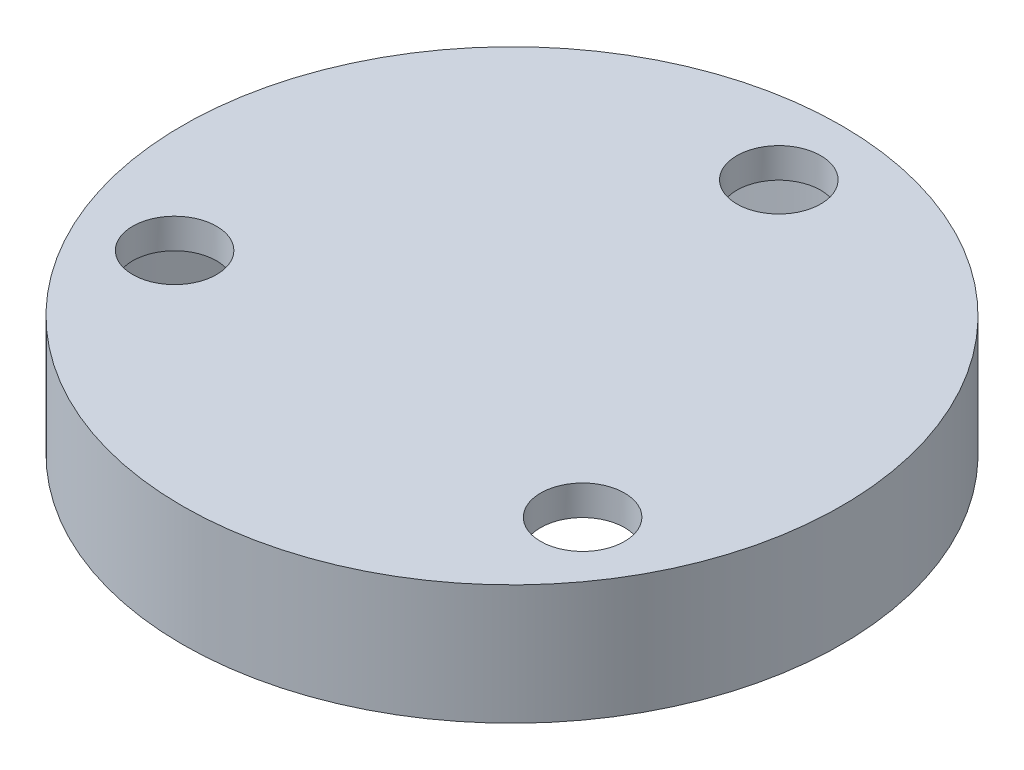
ISO-10303-21;
HEADER;
FILE_DESCRIPTION(('STEP AP214'),'2;1');
FILE_NAME('part.step','',(''),(''),'','','');
FILE_SCHEMA(('AUTOMOTIVE_DESIGN { 1 0 10303 214 1 1 1 1 }'));
ENDSEC;
DATA;
#1=APPLICATION_CONTEXT('core data for automotive mechanical design processes');
#2=APPLICATION_PROTOCOL_DEFINITION('international standard','automotive_design',2000,#1);
#3=PRODUCT_CONTEXT('',#1,'mechanical');
#4=PRODUCT('Part','Part','',(#3));
#5=PRODUCT_RELATED_PRODUCT_CATEGORY('part','',(#4));
#6=PRODUCT_DEFINITION_FORMATION('','',#4);
#7=PRODUCT_DEFINITION_CONTEXT('part definition',#1,'design');
#8=PRODUCT_DEFINITION('design','',#6,#7);
#9=PRODUCT_DEFINITION_SHAPE('','',#8);
#10=(LENGTH_UNIT() NAMED_UNIT(*) SI_UNIT(.MILLI.,.METRE.));
#11=(NAMED_UNIT(*) PLANE_ANGLE_UNIT() SI_UNIT($,.RADIAN.));
#12=(NAMED_UNIT(*) SI_UNIT($,.STERADIAN.) SOLID_ANGLE_UNIT());
#13=UNCERTAINTY_MEASURE_WITH_UNIT(LENGTH_MEASURE(1.E-05),#10,'distance_accuracy_value','');
#14=(GEOMETRIC_REPRESENTATION_CONTEXT(3) GLOBAL_UNCERTAINTY_ASSIGNED_CONTEXT((#13)) GLOBAL_UNIT_ASSIGNED_CONTEXT((#10,
#11,#12)) REPRESENTATION_CONTEXT('',''));
#15=CARTESIAN_POINT('',(0.,0.,0.));
#16=DIRECTION('',(0.,0.,1.));
#17=DIRECTION('',(1.,0.,0.));
#18=AXIS2_PLACEMENT_3D('',#15,#16,#17);
#19=CARTESIAN_POINT('',(0.,20.,0.));
#20=DIRECTION('',(0.,-1.,0.));
#21=DIRECTION('',(0.,0.,-1.));
#22=AXIS2_PLACEMENT_3D('',#19,#20,#21);
#23=CYLINDRICAL_SURFACE('',#22,55.);
#24=CARTESIAN_POINT('',(0.,20.,0.));
#25=DIRECTION('',(0.,1.,0.));
#26=DIRECTION('',(0.,0.,1.));
#27=AXIS2_PLACEMENT_3D('',#24,#25,#26);
#28=CIRCLE('',#27,55.);
#29=CARTESIAN_POINT('',(0.,20.,55.));
#30=VERTEX_POINT('',#29);
#31=EDGE_CURVE('E10',#30,#30,#28,.T.);
#32=ORIENTED_EDGE('',*,*,#31,.F.);
#33=EDGE_LOOP('',(#32));
#34=FACE_BOUND('',#33,.T.);
#35=CARTESIAN_POINT('',(0.,0.,0.));
#36=DIRECTION('',(0.,1.,0.));
#37=DIRECTION('',(0.,0.,1.));
#38=AXIS2_PLACEMENT_3D('',#35,#36,#37);
#39=CIRCLE('',#38,55.);
#40=CARTESIAN_POINT('',(0.,0.,55.));
#41=VERTEX_POINT('',#40);
#42=EDGE_CURVE('E46',#41,#41,#39,.T.);
#43=ORIENTED_EDGE('',*,*,#42,.T.);
#44=EDGE_LOOP('',(#43));
#45=FACE_BOUND('',#44,.T.);
#46=ADVANCED_FACE('F39',(#34,#45),#23,.T.);
#47=CARTESIAN_POINT('',(0.,20.,0.));
#48=DIRECTION('',(0.,1.,0.));
#49=DIRECTION('',(0.,0.,1.));
#50=AXIS2_PLACEMENT_3D('',#47,#48,#49);
#51=PLANE('',#50);
#52=CARTESIAN_POINT('',(34.9995995601236,20.,23.2169772070138));
#53=DIRECTION('',(0.,1.,0.));
#54=DIRECTION('',(0.,0.,1.));
#55=AXIS2_PLACEMENT_3D('',#52,#53,#54);
#56=CIRCLE('',#55,7.);
#57=CARTESIAN_POINT('',(34.9995995601236,20.,30.2169772070138));
#58=VERTEX_POINT('',#57);
#59=EDGE_CURVE('E119',#58,#58,#56,.T.);
#60=ORIENTED_EDGE('',*,*,#59,.F.);
#61=EDGE_LOOP('',(#60));
#62=FACE_BOUND('',#61,.T.);
#63=CARTESIAN_POINT('',(2.60669228029626,20.,-41.9190309448566));
#64=DIRECTION('',(0.,1.,0.));
#65=DIRECTION('',(0.,0.,1.));
#66=AXIS2_PLACEMENT_3D('',#63,#64,#65);
#67=CIRCLE('',#66,7.);
#68=CARTESIAN_POINT('',(2.60669228029626,20.,-34.9190309448566));
#69=VERTEX_POINT('',#68);
#70=EDGE_CURVE('E68',#69,#69,#67,.T.);
#71=ORIENTED_EDGE('',*,*,#70,.F.);
#72=EDGE_LOOP('',(#71));
#73=FACE_BOUND('',#72,.T.);
#74=CARTESIAN_POINT('',(-37.6062918404198,20.,18.7020537378431));
#75=DIRECTION('',(0.,1.,0.));
#76=DIRECTION('',(0.,0.,1.));
#77=AXIS2_PLACEMENT_3D('',#74,#75,#76);
#78=CIRCLE('',#77,7.);
#79=CARTESIAN_POINT('',(-37.6062918404198,20.,25.7020537378431));
#80=VERTEX_POINT('',#79);
#81=EDGE_CURVE('E58',#80,#80,#78,.T.);
#82=ORIENTED_EDGE('',*,*,#81,.F.);
#83=EDGE_LOOP('',(#82));
#84=FACE_BOUND('',#83,.T.);
#85=ORIENTED_EDGE('',*,*,#31,.T.);
#86=EDGE_LOOP('',(#85));
#87=FACE_BOUND('',#86,.T.);
#88=ADVANCED_FACE('F85',(#62,#73,#84,#87),#51,.T.);
#89=CARTESIAN_POINT('',(0.,0.,0.));
#90=DIRECTION('',(0.,1.,0.));
#91=DIRECTION('',(0.,0.,1.));
#92=AXIS2_PLACEMENT_3D('',#89,#90,#91);
#93=PLANE('',#92);
#94=CARTESIAN_POINT('',(0.,0.,0.));
#95=DIRECTION('',(0.,-1.,0.));
#96=DIRECTION('',(0.,0.,-1.));
#97=AXIS2_PLACEMENT_3D('',#94,#95,#96);
#98=CIRCLE('',#97,50.);
#99=CARTESIAN_POINT('',(0.,0.,-50.));
#100=VERTEX_POINT('',#99);
#101=EDGE_CURVE('E54',#100,#100,#98,.T.);
#102=ORIENTED_EDGE('',*,*,#101,.F.);
#103=EDGE_LOOP('',(#102));
#104=FACE_BOUND('',#103,.T.);
#105=ORIENTED_EDGE('',*,*,#42,.F.);
#106=EDGE_LOOP('',(#105));
#107=FACE_BOUND('',#106,.T.);
#108=ADVANCED_FACE('F79',(#104,#107),#93,.F.);
#109=CARTESIAN_POINT('',(0.,15.,0.));
#110=DIRECTION('',(0.,-1.,0.));
#111=DIRECTION('',(0.,0.,-1.));
#112=AXIS2_PLACEMENT_3D('',#109,#110,#111);
#113=CYLINDRICAL_SURFACE('',#112,50.);
#114=CARTESIAN_POINT('',(0.,15.,0.));
#115=DIRECTION('',(0.,-1.,0.));
#116=DIRECTION('',(0.,0.,-1.));
#117=AXIS2_PLACEMENT_3D('',#114,#115,#116);
#118=CIRCLE('',#117,50.);
#119=CARTESIAN_POINT('',(0.,15.,-50.));
#120=VERTEX_POINT('',#119);
#121=EDGE_CURVE('E51',#120,#120,#118,.T.);
#122=ORIENTED_EDGE('',*,*,#121,.F.);
#123=EDGE_LOOP('',(#122));
#124=FACE_BOUND('',#123,.T.);
#125=ORIENTED_EDGE('',*,*,#101,.T.);
#126=EDGE_LOOP('',(#125));
#127=FACE_BOUND('',#126,.T.);
#128=ADVANCED_FACE('F76',(#124,#127),#113,.F.);
#129=CARTESIAN_POINT('',(0.,15.,0.));
#130=DIRECTION('',(0.,-1.,0.));
#131=DIRECTION('',(0.,0.,-1.));
#132=AXIS2_PLACEMENT_3D('',#129,#130,#131);
#133=PLANE('',#132);
#134=CARTESIAN_POINT('',(34.9995995601236,15.,23.2169772070138));
#135=DIRECTION('',(0.,-1.,0.));
#136=DIRECTION('',(0.,0.,-1.));
#137=AXIS2_PLACEMENT_3D('',#134,#135,#136);
#138=CIRCLE('',#137,7.);
#139=CARTESIAN_POINT('',(34.9995995601236,15.,16.2169772070138));
#140=VERTEX_POINT('',#139);
#141=EDGE_CURVE('E42',#140,#140,#138,.T.);
#142=ORIENTED_EDGE('',*,*,#141,.F.);
#143=EDGE_LOOP('',(#142));
#144=FACE_BOUND('',#143,.T.);
#145=CARTESIAN_POINT('',(2.60669228029626,15.,-41.9190309448566));
#146=DIRECTION('',(0.,-1.,0.));
#147=DIRECTION('',(0.,0.,-1.));
#148=AXIS2_PLACEMENT_3D('',#145,#146,#147);
#149=CIRCLE('',#148,7.);
#150=CARTESIAN_POINT('',(2.60669228029626,15.,-48.9190309448566));
#151=VERTEX_POINT('',#150);
#152=EDGE_CURVE('E63',#151,#151,#149,.T.);
#153=ORIENTED_EDGE('',*,*,#152,.F.);
#154=EDGE_LOOP('',(#153));
#155=FACE_BOUND('',#154,.T.);
#156=CARTESIAN_POINT('',(-37.6062918404198,15.,18.7020537378431));
#157=DIRECTION('',(0.,-1.,0.));
#158=DIRECTION('',(0.,0.,-1.));
#159=AXIS2_PLACEMENT_3D('',#156,#157,#158);
#160=CIRCLE('',#159,7.);
#161=CARTESIAN_POINT('',(-37.6062918404198,15.,11.7020537378431));
#162=VERTEX_POINT('',#161);
#163=EDGE_CURVE('E56',#162,#162,#160,.T.);
#164=ORIENTED_EDGE('',*,*,#163,.F.);
#165=EDGE_LOOP('',(#164));
#166=FACE_BOUND('',#165,.T.);
#167=ORIENTED_EDGE('',*,*,#121,.T.);
#168=EDGE_LOOP('',(#167));
#169=FACE_BOUND('',#168,.T.);
#170=ADVANCED_FACE('F74',(#144,#155,#166,#169),#133,.T.);
#171=CARTESIAN_POINT('',(-37.6062918404198,20.,18.7020537378431));
#172=DIRECTION('',(0.,1.,0.));
#173=DIRECTION('',(0.,0.,1.));
#174=AXIS2_PLACEMENT_3D('',#171,#172,#173);
#175=CYLINDRICAL_SURFACE('',#174,7.);
#176=ORIENTED_EDGE('',*,*,#163,.T.);
#177=EDGE_LOOP('',(#176));
#178=FACE_BOUND('',#177,.T.);
#179=ORIENTED_EDGE('',*,*,#81,.T.);
#180=EDGE_LOOP('',(#179));
#181=FACE_BOUND('',#180,.T.);
#182=ADVANCED_FACE('F102',(#178,#181),#175,.F.);
#183=CARTESIAN_POINT('',(2.60669228029626,20.,-41.9190309448566));
#184=DIRECTION('',(0.,1.,0.));
#185=DIRECTION('',(0.,0.,1.));
#186=AXIS2_PLACEMENT_3D('',#183,#184,#185);
#187=CYLINDRICAL_SURFACE('',#186,7.);
#188=ORIENTED_EDGE('',*,*,#152,.T.);
#189=EDGE_LOOP('',(#188));
#190=FACE_BOUND('',#189,.T.);
#191=ORIENTED_EDGE('',*,*,#70,.T.);
#192=EDGE_LOOP('',(#191));
#193=FACE_BOUND('',#192,.T.);
#194=ADVANCED_FACE('F106',(#190,#193),#187,.F.);
#195=CARTESIAN_POINT('',(34.9995995601236,20.,23.2169772070138));
#196=DIRECTION('',(0.,1.,0.));
#197=DIRECTION('',(0.,0.,1.));
#198=AXIS2_PLACEMENT_3D('',#195,#196,#197);
#199=CYLINDRICAL_SURFACE('',#198,7.);
#200=ORIENTED_EDGE('',*,*,#141,.T.);
#201=EDGE_LOOP('',(#200));
#202=FACE_BOUND('',#201,.T.);
#203=ORIENTED_EDGE('',*,*,#59,.T.);
#204=EDGE_LOOP('',(#203));
#205=FACE_BOUND('',#204,.T.);
#206=ADVANCED_FACE('F109',(#202,#205),#199,.F.);
#207=CLOSED_SHELL('',(#46,#88,#108,#128,#170,#182,#194,#206));
#208=MANIFOLD_SOLID_BREP('B2',#207);
#209=ADVANCED_BREP_SHAPE_REPRESENTATION('',(#18,#208),#14);
#210=SHAPE_DEFINITION_REPRESENTATION(#9,#209);
ENDSEC;
END-ISO-10303-21;
